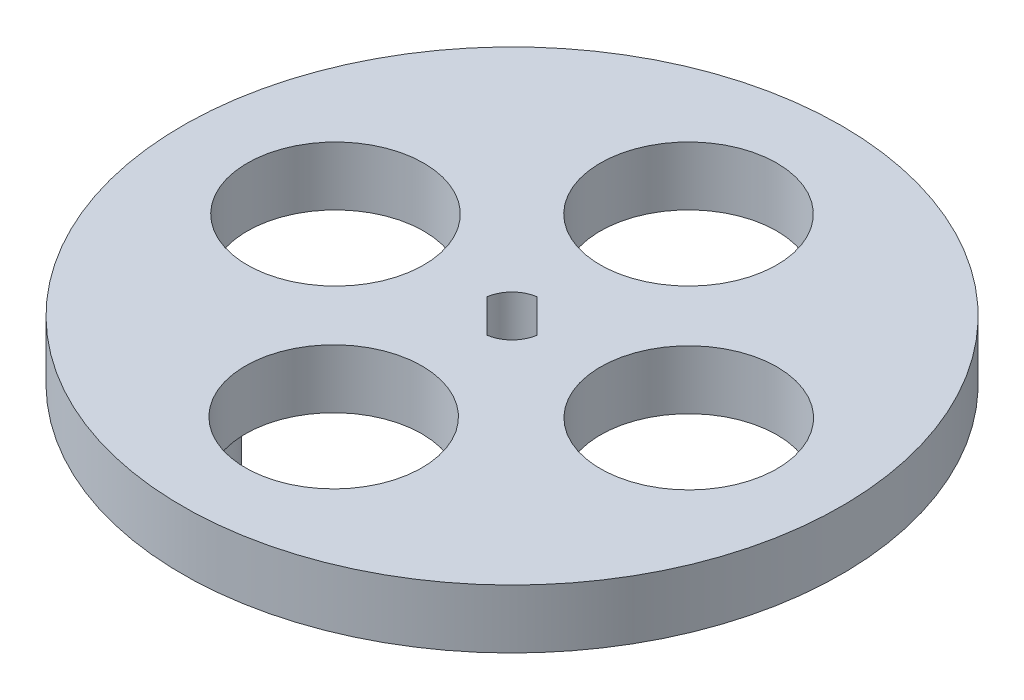
ISO-10303-21;
HEADER;
FILE_DESCRIPTION(('STEP AP214'),'2;1');
FILE_NAME('part.step','',(''),(''),'','','');
FILE_SCHEMA(('AUTOMOTIVE_DESIGN { 1 0 10303 214 1 1 1 1 }'));
ENDSEC;
DATA;
#1=APPLICATION_CONTEXT('core data for automotive mechanical design processes');
#2=APPLICATION_PROTOCOL_DEFINITION('international standard','automotive_design',2000,#1);
#3=PRODUCT_CONTEXT('',#1,'mechanical');
#4=PRODUCT('Part','Part','',(#3));
#5=PRODUCT_RELATED_PRODUCT_CATEGORY('part','',(#4));
#6=PRODUCT_DEFINITION_FORMATION('','',#4);
#7=PRODUCT_DEFINITION_CONTEXT('part definition',#1,'design');
#8=PRODUCT_DEFINITION('design','',#6,#7);
#9=PRODUCT_DEFINITION_SHAPE('','',#8);
#10=(LENGTH_UNIT() NAMED_UNIT(*) SI_UNIT(.MILLI.,.METRE.));
#11=(NAMED_UNIT(*) PLANE_ANGLE_UNIT() SI_UNIT($,.RADIAN.));
#12=(NAMED_UNIT(*) SI_UNIT($,.STERADIAN.) SOLID_ANGLE_UNIT());
#13=UNCERTAINTY_MEASURE_WITH_UNIT(LENGTH_MEASURE(1.E-05),#10,'distance_accuracy_value','');
#14=(GEOMETRIC_REPRESENTATION_CONTEXT(3) GLOBAL_UNCERTAINTY_ASSIGNED_CONTEXT((#13)) GLOBAL_UNIT_ASSIGNED_CONTEXT((#10,
#11,#12)) REPRESENTATION_CONTEXT('',''));
#15=CARTESIAN_POINT('',(0.,0.,0.));
#16=DIRECTION('',(0.,0.,1.));
#17=DIRECTION('',(1.,0.,0.));
#18=AXIS2_PLACEMENT_3D('',#15,#16,#17);
#19=CARTESIAN_POINT('',(0.,-5.,0.));
#20=DIRECTION('',(0.,1.,0.));
#21=DIRECTION('',(0.,0.,1.));
#22=AXIS2_PLACEMENT_3D('',#19,#20,#21);
#23=CYLINDRICAL_SURFACE('',#22,2.5);
#24=CARTESIAN_POINT('',(0.,0.,0.));
#25=DIRECTION('',(0.,-1.,0.));
#26=DIRECTION('',(0.,0.,-1.));
#27=AXIS2_PLACEMENT_3D('',#24,#25,#26);
#28=CIRCLE('',#27,2.5);
#29=CARTESIAN_POINT('',(2.47487373415292,0.,0.353553390593272));
#30=VERTEX_POINT('',#29);
#31=CARTESIAN_POINT('',(0.353553390593273,0.,2.47487373415292));
#32=VERTEX_POINT('',#31);
#33=EDGE_CURVE('E128',#30,#32,#28,.T.);
#34=ORIENTED_EDGE('',*,*,#33,.F.);
#35=DIRECTION('',(0.,-1.,0.));
#36=VECTOR('',#35,1.);
#37=CARTESIAN_POINT('',(2.47487373415292,4.03553390593274,0.353553390593273));
#38=LINE('',#37,#36);
#39=CARTESIAN_POINT('',(2.47487373415292,-5.,0.353553390593273));
#40=VERTEX_POINT('',#39);
#41=EDGE_CURVE('E56',#30,#40,#38,.T.);
#42=ORIENTED_EDGE('',*,*,#41,.T.);
#43=CARTESIAN_POINT('',(0.,-5.,0.));
#44=DIRECTION('',(0.,-1.,0.));
#45=DIRECTION('',(0.,0.,-1.));
#46=AXIS2_PLACEMENT_3D('',#43,#44,#45);
#47=CIRCLE('',#46,2.5);
#48=CARTESIAN_POINT('',(0.353553390593273,-5.,2.47487373415292));
#49=VERTEX_POINT('',#48);
#50=EDGE_CURVE('E126',#40,#49,#47,.T.);
#51=ORIENTED_EDGE('',*,*,#50,.T.);
#52=DIRECTION('',(0.,-1.,0.));
#53=VECTOR('',#52,1.);
#54=CARTESIAN_POINT('',(0.353553390593273,4.03553390593274,2.47487373415292));
#55=LINE('',#54,#53);
#56=EDGE_CURVE('E190',#32,#49,#55,.T.);
#57=ORIENTED_EDGE('',*,*,#56,.F.);
#58=EDGE_LOOP('',(#34,#42,#51,#57));
#59=FACE_BOUND('',#58,.T.);
#60=ADVANCED_FACE('F39',(#59),#23,.F.);
#61=CARTESIAN_POINT('',(0.,0.,0.));
#62=DIRECTION('',(0.,-1.,0.));
#63=DIRECTION('',(0.,0.,-1.));
#64=AXIS2_PLACEMENT_3D('',#61,#62,#63);
#65=PLANE('',#64);
#66=CARTESIAN_POINT('',(0.,0.,0.));
#67=DIRECTION('',(0.,-1.,0.));
#68=DIRECTION('',(0.,0.,-1.));
#69=AXIS2_PLACEMENT_3D('',#66,#67,#68);
#70=CIRCLE('',#69,28.);
#71=CARTESIAN_POINT('',(0.,0.,-28.));
#72=VERTEX_POINT('',#71);
#73=EDGE_CURVE('E11',#72,#72,#70,.T.);
#74=ORIENTED_EDGE('',*,*,#73,.F.);
#75=EDGE_LOOP('',(#74));
#76=FACE_BOUND('',#75,.T.);
#77=CARTESIAN_POINT('',(-15.,0.,0.));
#78=DIRECTION('',(0.,-1.,0.));
#79=DIRECTION('',(0.,0.,-1.));
#80=AXIS2_PLACEMENT_3D('',#77,#78,#79);
#81=CIRCLE('',#80,7.5);
#82=CARTESIAN_POINT('',(-15.,0.,-7.5));
#83=VERTEX_POINT('',#82);
#84=EDGE_CURVE('E146',#83,#83,#81,.T.);
#85=ORIENTED_EDGE('',*,*,#84,.T.);
#86=EDGE_LOOP('',(#85));
#87=FACE_BOUND('',#86,.T.);
#88=CARTESIAN_POINT('',(-0.156464867285832,0.,14.9991839359782));
#89=DIRECTION('',(0.,-1.,0.));
#90=DIRECTION('',(0.,0.,-1.));
#91=AXIS2_PLACEMENT_3D('',#88,#89,#90);
#92=CIRCLE('',#91,7.5);
#93=CARTESIAN_POINT('',(-0.156464867285832,0.,7.49918393597816));
#94=VERTEX_POINT('',#93);
#95=EDGE_CURVE('E145',#94,#94,#92,.T.);
#96=ORIENTED_EDGE('',*,*,#95,.T.);
#97=EDGE_LOOP('',(#96));
#98=FACE_BOUND('',#97,.T.);
#99=CARTESIAN_POINT('',(14.9999962811826,0.,-0.0105624101111734));
#100=DIRECTION('',(0.,-1.,0.));
#101=DIRECTION('',(0.,0.,-1.));
#102=AXIS2_PLACEMENT_3D('',#99,#100,#101);
#103=CIRCLE('',#102,7.5);
#104=CARTESIAN_POINT('',(14.9999962811826,0.,-7.51056241011117));
#105=VERTEX_POINT('',#104);
#106=EDGE_CURVE('E43',#105,#105,#103,.T.);
#107=ORIENTED_EDGE('',*,*,#106,.T.);
#108=EDGE_LOOP('',(#107));
#109=FACE_BOUND('',#108,.T.);
#110=CARTESIAN_POINT('',(-0.00627811594715311,0.,-14.9999986861753));
#111=DIRECTION('',(0.,-1.,0.));
#112=DIRECTION('',(0.,0.,-1.));
#113=AXIS2_PLACEMENT_3D('',#110,#111,#112);
#114=CIRCLE('',#113,7.5);
#115=CARTESIAN_POINT('',(-0.00627811594715311,0.,-22.4999986861753));
#116=VERTEX_POINT('',#115);
#117=EDGE_CURVE('E138',#116,#116,#114,.T.);
#118=ORIENTED_EDGE('',*,*,#117,.T.);
#119=EDGE_LOOP('',(#118));
#120=FACE_BOUND('',#119,.T.);
#121=CARTESIAN_POINT('',(-2.47487373415292,0.,-0.353553390593273));
#122=VERTEX_POINT('',#121);
#123=CARTESIAN_POINT('',(-0.353553390593272,0.,-2.47487373415292));
#124=VERTEX_POINT('',#123);
#125=EDGE_CURVE('E133',#122,#124,#28,.T.);
#126=ORIENTED_EDGE('',*,*,#125,.T.);
#127=DIRECTION('',(0.707106781186548,0.,0.707106781186547));
#128=VECTOR('',#127,1.);
#129=CARTESIAN_POINT('',(-0.353553390593272,0.,-2.47487373415292));
#130=LINE('',#129,#128);
#131=EDGE_CURVE('E186',#124,#30,#130,.T.);
#132=ORIENTED_EDGE('',*,*,#131,.T.);
#133=ORIENTED_EDGE('',*,*,#33,.T.);
#134=DIRECTION('',(-0.707106781186547,0.,-0.707106781186548));
#135=VECTOR('',#134,1.);
#136=CARTESIAN_POINT('',(-2.47487373415292,0.,-0.353553390593273));
#137=LINE('',#136,#135);
#138=EDGE_CURVE('E141',#32,#122,#137,.T.);
#139=ORIENTED_EDGE('',*,*,#138,.T.);
#140=EDGE_LOOP('',(#126,#132,#133,#139));
#141=FACE_BOUND('',#140,.T.);
#142=ADVANCED_FACE('F159',(#76,#87,#98,#109,#120,#141),#65,.F.);
#143=CARTESIAN_POINT('',(0.,-5.,0.));
#144=DIRECTION('',(0.,-1.,0.));
#145=DIRECTION('',(0.,0.,-1.));
#146=AXIS2_PLACEMENT_3D('',#143,#144,#145);
#147=PLANE('',#146);
#148=CARTESIAN_POINT('',(0.,-5.,0.));
#149=DIRECTION('',(0.,-1.,0.));
#150=DIRECTION('',(0.,0.,-1.));
#151=AXIS2_PLACEMENT_3D('',#148,#149,#150);
#152=CIRCLE('',#151,28.);
#153=CARTESIAN_POINT('',(0.,-5.,-28.));
#154=VERTEX_POINT('',#153);
#155=EDGE_CURVE('E48',#154,#154,#152,.T.);
#156=ORIENTED_EDGE('',*,*,#155,.T.);
#157=EDGE_LOOP('',(#156));
#158=FACE_BOUND('',#157,.T.);
#159=CARTESIAN_POINT('',(-15.,-5.,0.));
#160=DIRECTION('',(0.,-1.,0.));
#161=DIRECTION('',(0.,0.,-1.));
#162=AXIS2_PLACEMENT_3D('',#159,#160,#161);
#163=CIRCLE('',#162,7.5);
#164=CARTESIAN_POINT('',(-15.,-5.,-7.5));
#165=VERTEX_POINT('',#164);
#166=EDGE_CURVE('E153',#165,#165,#163,.T.);
#167=ORIENTED_EDGE('',*,*,#166,.F.);
#168=EDGE_LOOP('',(#167));
#169=FACE_BOUND('',#168,.T.);
#170=CARTESIAN_POINT('',(-0.156464867285832,-5.,14.9991839359782));
#171=DIRECTION('',(0.,-1.,0.));
#172=DIRECTION('',(0.,0.,-1.));
#173=AXIS2_PLACEMENT_3D('',#170,#171,#172);
#174=CIRCLE('',#173,7.5);
#175=CARTESIAN_POINT('',(-0.156464867285832,-5.,7.49918393597816));
#176=VERTEX_POINT('',#175);
#177=EDGE_CURVE('E143',#176,#176,#174,.T.);
#178=ORIENTED_EDGE('',*,*,#177,.F.);
#179=EDGE_LOOP('',(#178));
#180=FACE_BOUND('',#179,.T.);
#181=CARTESIAN_POINT('',(14.9999962811826,-5.,-0.0105624101111734));
#182=DIRECTION('',(0.,-1.,0.));
#183=DIRECTION('',(0.,0.,-1.));
#184=AXIS2_PLACEMENT_3D('',#181,#182,#183);
#185=CIRCLE('',#184,7.5);
#186=CARTESIAN_POINT('',(14.9999962811826,-5.,-7.51056241011117));
#187=VERTEX_POINT('',#186);
#188=EDGE_CURVE('E150',#187,#187,#185,.T.);
#189=ORIENTED_EDGE('',*,*,#188,.F.);
#190=EDGE_LOOP('',(#189));
#191=FACE_BOUND('',#190,.T.);
#192=CARTESIAN_POINT('',(-0.00627811594715311,-5.,-14.9999986861753));
#193=DIRECTION('',(0.,-1.,0.));
#194=DIRECTION('',(0.,0.,-1.));
#195=AXIS2_PLACEMENT_3D('',#192,#193,#194);
#196=CIRCLE('',#195,7.5);
#197=CARTESIAN_POINT('',(-0.00627811594715311,-5.,-22.4999986861753));
#198=VERTEX_POINT('',#197);
#199=EDGE_CURVE('E147',#198,#198,#196,.T.);
#200=ORIENTED_EDGE('',*,*,#199,.F.);
#201=EDGE_LOOP('',(#200));
#202=FACE_BOUND('',#201,.T.);
#203=CARTESIAN_POINT('',(-15.0413494557143,-5.,14.9893350899219));
#204=DIRECTION('',(0.,-1.,0.));
#205=DIRECTION('',(0.,0.,-1.));
#206=AXIS2_PLACEMENT_3D('',#203,#204,#205);
#207=CIRCLE('',#206,5.);
#208=CARTESIAN_POINT('',(-15.0413494557143,-5.,9.98933508992194));
#209=VERTEX_POINT('',#208);
#210=EDGE_CURVE('E155',#209,#209,#207,.T.);
#211=ORIENTED_EDGE('',*,*,#210,.F.);
#212=EDGE_LOOP('',(#211));
#213=FACE_BOUND('',#212,.T.);
#214=ORIENTED_EDGE('',*,*,#50,.F.);
#215=DIRECTION('',(-0.707106781186548,0.,-0.707106781186548));
#216=VECTOR('',#215,1.);
#217=CARTESIAN_POINT('',(-0.353553390593272,-5.,-2.47487373415292));
#218=LINE('',#217,#216);
#219=CARTESIAN_POINT('',(-0.353553390593272,-5.,-2.47487373415292));
#220=VERTEX_POINT('',#219);
#221=EDGE_CURVE('E113',#40,#220,#218,.T.);
#222=ORIENTED_EDGE('',*,*,#221,.T.);
#223=CARTESIAN_POINT('',(-2.47487373415292,-5.,-0.353553390593273));
#224=VERTEX_POINT('',#223);
#225=EDGE_CURVE('E134',#224,#220,#47,.T.);
#226=ORIENTED_EDGE('',*,*,#225,.F.);
#227=DIRECTION('',(0.707106781186547,0.,0.707106781186548));
#228=VECTOR('',#227,1.);
#229=CARTESIAN_POINT('',(-2.47487373415292,-5.,-0.353553390593273));
#230=LINE('',#229,#228);
#231=EDGE_CURVE('E132',#224,#49,#230,.T.);
#232=ORIENTED_EDGE('',*,*,#231,.T.);
#233=EDGE_LOOP('',(#214,#222,#226,#232));
#234=FACE_BOUND('',#233,.T.);
#235=ADVANCED_FACE('F131',(#158,#169,#180,#191,#202,#213,#234),#147,.T.);
#236=CARTESIAN_POINT('',(0.,-5.,0.));
#237=DIRECTION('',(0.,1.,0.));
#238=DIRECTION('',(0.,0.,1.));
#239=AXIS2_PLACEMENT_3D('',#236,#237,#238);
#240=CYLINDRICAL_SURFACE('',#239,28.);
#241=ORIENTED_EDGE('',*,*,#73,.T.);
#242=EDGE_LOOP('',(#241));
#243=FACE_BOUND('',#242,.T.);
#244=ORIENTED_EDGE('',*,*,#155,.F.);
#245=EDGE_LOOP('',(#244));
#246=FACE_BOUND('',#245,.T.);
#247=ADVANCED_FACE('F172',(#243,#246),#240,.T.);
#248=ORIENTED_EDGE('',*,*,#225,.T.);
#249=DIRECTION('',(0.,-1.,0.));
#250=VECTOR('',#249,1.);
#251=CARTESIAN_POINT('',(-0.353553390593272,4.03553390593274,-2.47487373415292));
#252=LINE('',#251,#250);
#253=EDGE_CURVE('E116',#124,#220,#252,.T.);
#254=ORIENTED_EDGE('',*,*,#253,.F.);
#255=ORIENTED_EDGE('',*,*,#125,.F.);
#256=DIRECTION('',(0.,-1.,0.));
#257=VECTOR('',#256,1.);
#258=CARTESIAN_POINT('',(-2.47487373415292,4.03553390593274,-0.353553390593273));
#259=LINE('',#258,#257);
#260=EDGE_CURVE('E64',#122,#224,#259,.T.);
#261=ORIENTED_EDGE('',*,*,#260,.T.);
#262=EDGE_LOOP('',(#248,#254,#255,#261));
#263=FACE_BOUND('',#262,.T.);
#264=ADVANCED_FACE('F166',(#263),#23,.F.);
#265=CARTESIAN_POINT('',(-0.00627811594715311,-5.,-14.9999986861753));
#266=DIRECTION('',(0.,1.,0.));
#267=DIRECTION('',(0.,0.,1.));
#268=AXIS2_PLACEMENT_3D('',#265,#266,#267);
#269=CYLINDRICAL_SURFACE('',#268,7.5);
#270=ORIENTED_EDGE('',*,*,#117,.F.);
#271=EDGE_LOOP('',(#270));
#272=FACE_BOUND('',#271,.T.);
#273=ORIENTED_EDGE('',*,*,#199,.T.);
#274=EDGE_LOOP('',(#273));
#275=FACE_BOUND('',#274,.T.);
#276=ADVANCED_FACE('F162',(#272,#275),#269,.F.);
#277=CARTESIAN_POINT('',(14.9999962811826,-5.,-0.0105624101111734));
#278=DIRECTION('',(0.,1.,0.));
#279=DIRECTION('',(0.,0.,1.));
#280=AXIS2_PLACEMENT_3D('',#277,#278,#279);
#281=CYLINDRICAL_SURFACE('',#280,7.5);
#282=ORIENTED_EDGE('',*,*,#106,.F.);
#283=EDGE_LOOP('',(#282));
#284=FACE_BOUND('',#283,.T.);
#285=ORIENTED_EDGE('',*,*,#188,.T.);
#286=EDGE_LOOP('',(#285));
#287=FACE_BOUND('',#286,.T.);
#288=ADVANCED_FACE('F165',(#284,#287),#281,.F.);
#289=CARTESIAN_POINT('',(-0.156464867285832,-5.,14.9991839359782));
#290=DIRECTION('',(0.,1.,0.));
#291=DIRECTION('',(0.,0.,1.));
#292=AXIS2_PLACEMENT_3D('',#289,#290,#291);
#293=CYLINDRICAL_SURFACE('',#292,7.5);
#294=ORIENTED_EDGE('',*,*,#95,.F.);
#295=EDGE_LOOP('',(#294));
#296=FACE_BOUND('',#295,.T.);
#297=ORIENTED_EDGE('',*,*,#177,.T.);
#298=EDGE_LOOP('',(#297));
#299=FACE_BOUND('',#298,.T.);
#300=ADVANCED_FACE('F218',(#296,#299),#293,.F.);
#301=CARTESIAN_POINT('',(-15.,-5.,0.));
#302=DIRECTION('',(0.,1.,0.));
#303=DIRECTION('',(0.,0.,1.));
#304=AXIS2_PLACEMENT_3D('',#301,#302,#303);
#305=CYLINDRICAL_SURFACE('',#304,7.5);
#306=ORIENTED_EDGE('',*,*,#84,.F.);
#307=EDGE_LOOP('',(#306));
#308=FACE_BOUND('',#307,.T.);
#309=ORIENTED_EDGE('',*,*,#166,.T.);
#310=EDGE_LOOP('',(#309));
#311=FACE_BOUND('',#310,.T.);
#312=ADVANCED_FACE('F180',(#308,#311),#305,.F.);
#313=CARTESIAN_POINT('',(-15.0413494557143,-10.,14.9893350899219));
#314=DIRECTION('',(0.,1.,0.));
#315=DIRECTION('',(0.,0.,1.));
#316=AXIS2_PLACEMENT_3D('',#313,#314,#315);
#317=CYLINDRICAL_SURFACE('',#316,5.);
#318=ORIENTED_EDGE('',*,*,#210,.T.);
#319=EDGE_LOOP('',(#318));
#320=FACE_BOUND('',#319,.T.);
#321=CARTESIAN_POINT('',(-15.0413494557143,-11.,14.9893350899219));
#322=DIRECTION('',(0.,-1.,0.));
#323=DIRECTION('',(0.,0.,-1.));
#324=AXIS2_PLACEMENT_3D('',#321,#322,#323);
#325=CIRCLE('',#324,4.99999999999996);
#326=CARTESIAN_POINT('',(-15.0413494557143,-11.,9.98933508992194));
#327=VERTEX_POINT('',#326);
#328=EDGE_CURVE('E121',#327,#327,#325,.T.);
#329=ORIENTED_EDGE('',*,*,#328,.F.);
#330=EDGE_LOOP('',(#329));
#331=FACE_BOUND('',#330,.T.);
#332=ADVANCED_FACE('F41',(#320,#331),#317,.T.);
#333=CARTESIAN_POINT('',(-2.47487373415292,4.03553390593274,-0.353553390593273));
#334=DIRECTION('',(0.707106781186548,0.,-0.707106781186547));
#335=DIRECTION('',(-0.707106781186547,0.,-0.707106781186548));
#336=AXIS2_PLACEMENT_3D('',#333,#334,#335);
#337=PLANE('',#336);
#338=ORIENTED_EDGE('',*,*,#138,.F.);
#339=ORIENTED_EDGE('',*,*,#56,.T.);
#340=ORIENTED_EDGE('',*,*,#231,.F.);
#341=ORIENTED_EDGE('',*,*,#260,.F.);
#342=EDGE_LOOP('',(#338,#339,#340,#341));
#343=FACE_BOUND('',#342,.T.);
#344=ADVANCED_FACE('F179',(#343),#337,.T.);
#345=CARTESIAN_POINT('',(-0.353553390593272,4.03553390593274,-2.47487373415292));
#346=DIRECTION('',(-0.707106781186547,0.,0.707106781186548));
#347=DIRECTION('',(0.707106781186548,0.,0.707106781186547));
#348=AXIS2_PLACEMENT_3D('',#345,#346,#347);
#349=PLANE('',#348);
#350=ORIENTED_EDGE('',*,*,#131,.F.);
#351=ORIENTED_EDGE('',*,*,#253,.T.);
#352=ORIENTED_EDGE('',*,*,#221,.F.);
#353=ORIENTED_EDGE('',*,*,#41,.F.);
#354=EDGE_LOOP('',(#350,#351,#352,#353));
#355=FACE_BOUND('',#354,.T.);
#356=ADVANCED_FACE('F114',(#355),#349,.T.);
#357=CARTESIAN_POINT('',(-15.0413494557143,-11.,14.9893350899219));
#358=DIRECTION('',(0.,-1.,0.));
#359=DIRECTION('',(0.,0.,-1.));
#360=AXIS2_PLACEMENT_3D('',#357,#358,#359);
#361=PLANE('',#360);
#362=ORIENTED_EDGE('',*,*,#328,.T.);
#363=EDGE_LOOP('',(#362));
#364=FACE_BOUND('',#363,.T.);
#365=ADVANCED_FACE('F198',(#364),#361,.T.);
#366=CLOSED_SHELL('',(#60,#142,#235,#247,#264,#276,#288,#300,#312,#332,#344,#356,#365));
#367=MANIFOLD_SOLID_BREP('B2',#366);
#368=ADVANCED_BREP_SHAPE_REPRESENTATION('',(#18,#367),#14);
#369=SHAPE_DEFINITION_REPRESENTATION(#9,#368);
ENDSEC;
END-ISO-10303-21;
